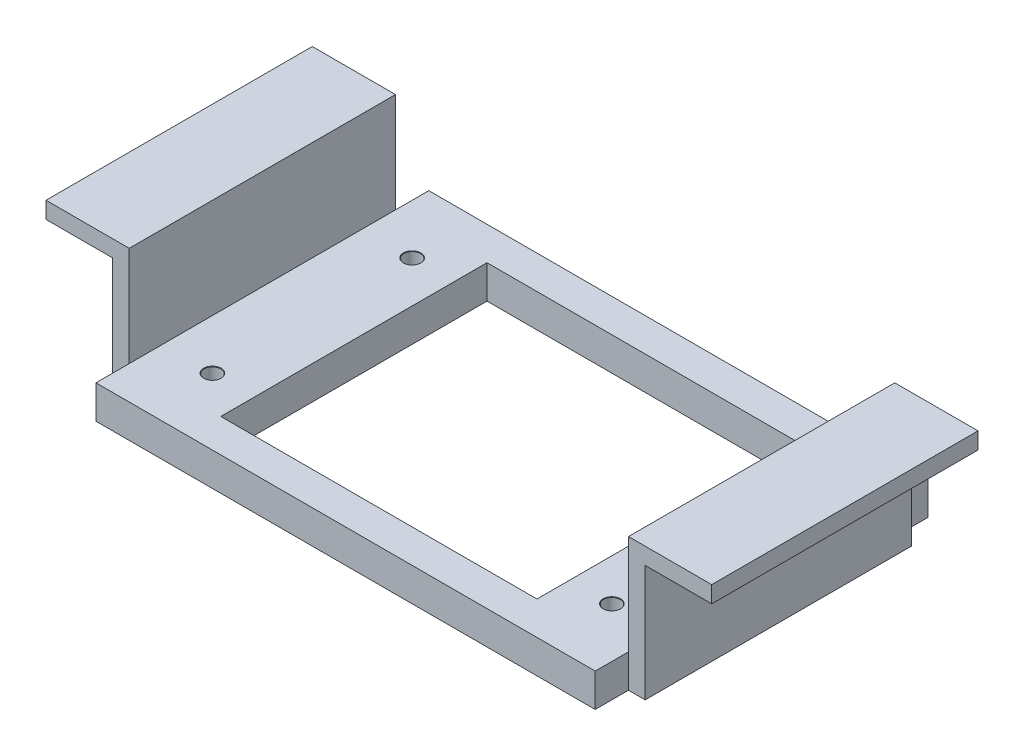
ISO-10303-21;
HEADER;
FILE_DESCRIPTION(('STEP AP214'),'2;1');
FILE_NAME('part.step','',(''),(''),'','','');
FILE_SCHEMA(('AUTOMOTIVE_DESIGN { 1 0 10303 214 1 1 1 1 }'));
ENDSEC;
DATA;
#1=APPLICATION_CONTEXT('core data for automotive mechanical design processes');
#2=APPLICATION_PROTOCOL_DEFINITION('international standard','automotive_design',2000,#1);
#3=PRODUCT_CONTEXT('',#1,'mechanical');
#4=PRODUCT('Part','Part','',(#3));
#5=PRODUCT_RELATED_PRODUCT_CATEGORY('part','',(#4));
#6=PRODUCT_DEFINITION_FORMATION('','',#4);
#7=PRODUCT_DEFINITION_CONTEXT('part definition',#1,'design');
#8=PRODUCT_DEFINITION('design','',#6,#7);
#9=PRODUCT_DEFINITION_SHAPE('','',#8);
#10=(LENGTH_UNIT() NAMED_UNIT(*) SI_UNIT(.MILLI.,.METRE.));
#11=(NAMED_UNIT(*) PLANE_ANGLE_UNIT() SI_UNIT($,.RADIAN.));
#12=(NAMED_UNIT(*) SI_UNIT($,.STERADIAN.) SOLID_ANGLE_UNIT());
#13=UNCERTAINTY_MEASURE_WITH_UNIT(LENGTH_MEASURE(1.E-05),#10,'distance_accuracy_value','');
#14=(GEOMETRIC_REPRESENTATION_CONTEXT(3) GLOBAL_UNCERTAINTY_ASSIGNED_CONTEXT((#13)) GLOBAL_UNIT_ASSIGNED_CONTEXT((#10,
#11,#12)) REPRESENTATION_CONTEXT('',''));
#15=CARTESIAN_POINT('',(0.,0.,0.));
#16=DIRECTION('',(0.,0.,1.));
#17=DIRECTION('',(1.,0.,0.));
#18=AXIS2_PLACEMENT_3D('',#15,#16,#17);
#19=CARTESIAN_POINT('',(16.,2.,8.));
#20=DIRECTION('',(0.,0.,-1.));
#21=DIRECTION('',(-1.,0.,0.));
#22=AXIS2_PLACEMENT_3D('',#19,#20,#21);
#23=PLANE('',#22);
#24=DIRECTION('',(0.,-1.,0.));
#25=VECTOR('',#24,1.);
#26=CARTESIAN_POINT('',(-15.,2.,8.));
#27=LINE('',#26,#25);
#28=CARTESIAN_POINT('',(-15.,2.,8.));
#29=VERTEX_POINT('',#28);
#30=CARTESIAN_POINT('',(-15.,0.,8.));
#31=VERTEX_POINT('',#30);
#32=EDGE_CURVE('E237',#29,#31,#27,.T.);
#33=ORIENTED_EDGE('',*,*,#32,.F.);
#34=DIRECTION('',(0.,-1.,0.));
#35=VECTOR('',#34,1.);
#36=CARTESIAN_POINT('',(-15.,8.,8.));
#37=LINE('',#36,#35);
#38=CARTESIAN_POINT('',(-15.,8.,8.));
#39=VERTEX_POINT('',#38);
#40=EDGE_CURVE('E456',#39,#29,#37,.T.);
#41=ORIENTED_EDGE('',*,*,#40,.F.);
#42=DIRECTION('',(1.,0.,0.));
#43=VECTOR('',#42,1.);
#44=CARTESIAN_POINT('',(-16.,8.,8.));
#45=LINE('',#44,#43);
#46=CARTESIAN_POINT('',(-20.,8.,8.));
#47=VERTEX_POINT('',#46);
#48=EDGE_CURVE('E440',#47,#39,#45,.T.);
#49=ORIENTED_EDGE('',*,*,#48,.F.);
#50=DIRECTION('',(0.,1.,0.));
#51=VECTOR('',#50,1.);
#52=CARTESIAN_POINT('',(-20.,8.,8.));
#53=LINE('',#52,#51);
#54=CARTESIAN_POINT('',(-20.,7.,8.));
#55=VERTEX_POINT('',#54);
#56=EDGE_CURVE('E399',#55,#47,#53,.T.);
#57=ORIENTED_EDGE('',*,*,#56,.F.);
#58=DIRECTION('',(1.,0.,0.));
#59=VECTOR('',#58,1.);
#60=CARTESIAN_POINT('',(-20.,7.,8.));
#61=LINE('',#60,#59);
#62=CARTESIAN_POINT('',(-16.,7.,8.));
#63=VERTEX_POINT('',#62);
#64=EDGE_CURVE('E407',#55,#63,#61,.T.);
#65=ORIENTED_EDGE('',*,*,#64,.T.);
#66=DIRECTION('',(0.,-1.,0.));
#67=VECTOR('',#66,1.);
#68=CARTESIAN_POINT('',(-16.,2.,8.));
#69=LINE('',#68,#67);
#70=CARTESIAN_POINT('',(-16.,0.,8.));
#71=VERTEX_POINT('',#70);
#72=EDGE_CURVE('E11',#63,#71,#69,.T.);
#73=ORIENTED_EDGE('',*,*,#72,.T.);
#74=DIRECTION('',(1.,0.,0.));
#75=VECTOR('',#74,1.);
#76=CARTESIAN_POINT('',(16.,0.,8.));
#77=LINE('',#76,#75);
#78=EDGE_CURVE('E473',#71,#31,#77,.T.);
#79=ORIENTED_EDGE('',*,*,#78,.T.);
#80=EDGE_LOOP('',(#33,#41,#49,#57,#65,#73,#79));
#81=FACE_BOUND('',#80,.T.);
#82=ADVANCED_FACE('F39',(#81),#23,.F.);
#83=DIRECTION('',(0.,1.,0.));
#84=VECTOR('',#83,1.);
#85=CARTESIAN_POINT('',(14.9984114699708,2.,8.));
#86=LINE('',#85,#84);
#87=CARTESIAN_POINT('',(14.9984114699708,0.,8.));
#88=VERTEX_POINT('',#87);
#89=CARTESIAN_POINT('',(14.9984114699708,2.,8.));
#90=VERTEX_POINT('',#89);
#91=EDGE_CURVE('E248',#88,#90,#86,.T.);
#92=ORIENTED_EDGE('',*,*,#91,.F.);
#93=CARTESIAN_POINT('',(16.,0.,8.));
#94=VERTEX_POINT('',#93);
#95=EDGE_CURVE('E472',#88,#94,#77,.T.);
#96=ORIENTED_EDGE('',*,*,#95,.T.);
#97=DIRECTION('',(0.,-1.,0.));
#98=VECTOR('',#97,1.);
#99=CARTESIAN_POINT('',(16.,2.,8.));
#100=LINE('',#99,#98);
#101=CARTESIAN_POINT('',(16.,7.,8.));
#102=VERTEX_POINT('',#101);
#103=EDGE_CURVE('E48',#102,#94,#100,.T.);
#104=ORIENTED_EDGE('',*,*,#103,.F.);
#105=DIRECTION('',(-1.,0.,0.));
#106=VECTOR('',#105,1.);
#107=CARTESIAN_POINT('',(20.,7.,8.));
#108=LINE('',#107,#106);
#109=CARTESIAN_POINT('',(20.,7.,8.));
#110=VERTEX_POINT('',#109);
#111=EDGE_CURVE('E387',#110,#102,#108,.T.);
#112=ORIENTED_EDGE('',*,*,#111,.F.);
#113=DIRECTION('',(0.,-1.,0.));
#114=VECTOR('',#113,1.);
#115=CARTESIAN_POINT('',(20.,8.,8.));
#116=LINE('',#115,#114);
#117=CARTESIAN_POINT('',(20.,8.,8.));
#118=VERTEX_POINT('',#117);
#119=EDGE_CURVE('E365',#118,#110,#116,.T.);
#120=ORIENTED_EDGE('',*,*,#119,.F.);
#121=DIRECTION('',(1.,0.,0.));
#122=VECTOR('',#121,1.);
#123=CARTESIAN_POINT('',(16.,8.,8.));
#124=LINE('',#123,#122);
#125=CARTESIAN_POINT('',(15.,8.,8.));
#126=VERTEX_POINT('',#125);
#127=EDGE_CURVE('E425',#126,#118,#124,.T.);
#128=ORIENTED_EDGE('',*,*,#127,.F.);
#129=DIRECTION('',(0.,-1.,0.));
#130=VECTOR('',#129,1.);
#131=CARTESIAN_POINT('',(15.,8.,8.));
#132=LINE('',#131,#130);
#133=CARTESIAN_POINT('',(15.,2.,8.));
#134=VERTEX_POINT('',#133);
#135=EDGE_CURVE('E428',#126,#134,#132,.T.);
#136=ORIENTED_EDGE('',*,*,#135,.T.);
#137=DIRECTION('',(1.,0.,0.));
#138=VECTOR('',#137,1.);
#139=CARTESIAN_POINT('',(16.,2.,8.));
#140=LINE('',#139,#138);
#141=EDGE_CURVE('E461',#90,#134,#140,.T.);
#142=ORIENTED_EDGE('',*,*,#141,.F.);
#143=EDGE_LOOP('',(#92,#96,#104,#112,#120,#128,#136,#142));
#144=FACE_BOUND('',#143,.T.);
#145=ADVANCED_FACE('F511',(#144),#23,.F.);
#146=CARTESIAN_POINT('',(16.,2.,-8.));
#147=DIRECTION('',(0.,0.,1.));
#148=DIRECTION('',(1.,0.,0.));
#149=AXIS2_PLACEMENT_3D('',#146,#147,#148);
#150=PLANE('',#149);
#151=DIRECTION('',(0.,-1.,0.));
#152=VECTOR('',#151,1.);
#153=CARTESIAN_POINT('',(15.,2.,-8.));
#154=LINE('',#153,#152);
#155=CARTESIAN_POINT('',(15.,2.,-8.));
#156=VERTEX_POINT('',#155);
#157=CARTESIAN_POINT('',(15.,0.,-8.));
#158=VERTEX_POINT('',#157);
#159=EDGE_CURVE('E279',#156,#158,#154,.T.);
#160=ORIENTED_EDGE('',*,*,#159,.F.);
#161=DIRECTION('',(0.,-1.,0.));
#162=VECTOR('',#161,1.);
#163=CARTESIAN_POINT('',(15.,8.,-8.));
#164=LINE('',#163,#162);
#165=CARTESIAN_POINT('',(15.,8.,-8.));
#166=VERTEX_POINT('',#165);
#167=EDGE_CURVE('E435',#166,#156,#164,.T.);
#168=ORIENTED_EDGE('',*,*,#167,.F.);
#169=DIRECTION('',(-1.,0.,0.));
#170=VECTOR('',#169,1.);
#171=CARTESIAN_POINT('',(16.,8.,-8.));
#172=LINE('',#171,#170);
#173=CARTESIAN_POINT('',(20.,8.,-8.));
#174=VERTEX_POINT('',#173);
#175=EDGE_CURVE('E419',#174,#166,#172,.T.);
#176=ORIENTED_EDGE('',*,*,#175,.F.);
#177=DIRECTION('',(0.,1.,0.));
#178=VECTOR('',#177,1.);
#179=CARTESIAN_POINT('',(20.,8.,-8.));
#180=LINE('',#179,#178);
#181=CARTESIAN_POINT('',(20.,7.,-8.));
#182=VERTEX_POINT('',#181);
#183=EDGE_CURVE('E372',#182,#174,#180,.T.);
#184=ORIENTED_EDGE('',*,*,#183,.F.);
#185=DIRECTION('',(-1.,0.,0.));
#186=VECTOR('',#185,1.);
#187=CARTESIAN_POINT('',(20.,7.,-8.));
#188=LINE('',#187,#186);
#189=CARTESIAN_POINT('',(16.,7.,-8.));
#190=VERTEX_POINT('',#189);
#191=EDGE_CURVE('E380',#182,#190,#188,.T.);
#192=ORIENTED_EDGE('',*,*,#191,.T.);
#193=DIRECTION('',(0.,-1.,0.));
#194=VECTOR('',#193,1.);
#195=CARTESIAN_POINT('',(16.,2.,-8.));
#196=LINE('',#195,#194);
#197=CARTESIAN_POINT('',(16.,0.,-8.));
#198=VERTEX_POINT('',#197);
#199=EDGE_CURVE('E486',#190,#198,#196,.T.);
#200=ORIENTED_EDGE('',*,*,#199,.T.);
#201=DIRECTION('',(-1.,0.,0.));
#202=VECTOR('',#201,1.);
#203=CARTESIAN_POINT('',(16.,0.,-8.));
#204=LINE('',#203,#202);
#205=EDGE_CURVE('E465',#198,#158,#204,.T.);
#206=ORIENTED_EDGE('',*,*,#205,.T.);
#207=EDGE_LOOP('',(#160,#168,#176,#184,#192,#200,#206));
#208=FACE_BOUND('',#207,.T.);
#209=ADVANCED_FACE('F503',(#208),#150,.F.);
#210=DIRECTION('',(0.,1.,0.));
#211=VECTOR('',#210,1.);
#212=CARTESIAN_POINT('',(-14.9984114699708,2.,-8.));
#213=LINE('',#212,#211);
#214=CARTESIAN_POINT('',(-14.9984114699708,0.,-8.));
#215=VERTEX_POINT('',#214);
#216=CARTESIAN_POINT('',(-14.9984114699708,2.,-8.));
#217=VERTEX_POINT('',#216);
#218=EDGE_CURVE('E285',#215,#217,#213,.T.);
#219=ORIENTED_EDGE('',*,*,#218,.F.);
#220=CARTESIAN_POINT('',(-16.,0.,-8.));
#221=VERTEX_POINT('',#220);
#222=EDGE_CURVE('E480',#215,#221,#204,.T.);
#223=ORIENTED_EDGE('',*,*,#222,.T.);
#224=DIRECTION('',(0.,-1.,0.));
#225=VECTOR('',#224,1.);
#226=CARTESIAN_POINT('',(-16.,2.,-8.));
#227=LINE('',#226,#225);
#228=CARTESIAN_POINT('',(-16.,7.,-8.));
#229=VERTEX_POINT('',#228);
#230=EDGE_CURVE('E468',#229,#221,#227,.T.);
#231=ORIENTED_EDGE('',*,*,#230,.F.);
#232=DIRECTION('',(1.,0.,0.));
#233=VECTOR('',#232,1.);
#234=CARTESIAN_POINT('',(-20.,7.,-8.));
#235=LINE('',#234,#233);
#236=CARTESIAN_POINT('',(-20.,7.,-8.));
#237=VERTEX_POINT('',#236);
#238=EDGE_CURVE('E414',#237,#229,#235,.T.);
#239=ORIENTED_EDGE('',*,*,#238,.F.);
#240=DIRECTION('',(0.,-1.,0.));
#241=VECTOR('',#240,1.);
#242=CARTESIAN_POINT('',(-20.,8.,-8.));
#243=LINE('',#242,#241);
#244=CARTESIAN_POINT('',(-20.,8.,-8.));
#245=VERTEX_POINT('',#244);
#246=EDGE_CURVE('E392',#245,#237,#243,.T.);
#247=ORIENTED_EDGE('',*,*,#246,.F.);
#248=DIRECTION('',(-1.,0.,0.));
#249=VECTOR('',#248,1.);
#250=CARTESIAN_POINT('',(-16.,8.,-8.));
#251=LINE('',#250,#249);
#252=CARTESIAN_POINT('',(-15.,8.,-8.));
#253=VERTEX_POINT('',#252);
#254=EDGE_CURVE('E446',#253,#245,#251,.T.);
#255=ORIENTED_EDGE('',*,*,#254,.F.);
#256=DIRECTION('',(0.,-1.,0.));
#257=VECTOR('',#256,1.);
#258=CARTESIAN_POINT('',(-15.,8.,-8.));
#259=LINE('',#258,#257);
#260=CARTESIAN_POINT('',(-15.,2.,-8.));
#261=VERTEX_POINT('',#260);
#262=EDGE_CURVE('E449',#253,#261,#259,.T.);
#263=ORIENTED_EDGE('',*,*,#262,.T.);
#264=DIRECTION('',(-1.,0.,0.));
#265=VECTOR('',#264,1.);
#266=CARTESIAN_POINT('',(16.,2.,-8.));
#267=LINE('',#266,#265);
#268=EDGE_CURVE('E464',#217,#261,#267,.T.);
#269=ORIENTED_EDGE('',*,*,#268,.F.);
#270=EDGE_LOOP('',(#219,#223,#231,#239,#247,#255,#263,#269));
#271=FACE_BOUND('',#270,.T.);
#272=ADVANCED_FACE('F591',(#271),#150,.F.);
#273=CARTESIAN_POINT('',(16.,2.,8.));
#274=DIRECTION('',(-1.,0.,0.));
#275=DIRECTION('',(0.,0.,1.));
#276=AXIS2_PLACEMENT_3D('',#273,#274,#275);
#277=PLANE('',#276);
#278=DIRECTION('',(0.,0.,-1.));
#279=VECTOR('',#278,1.);
#280=CARTESIAN_POINT('',(16.,7.,8.));
#281=LINE('',#280,#279);
#282=EDGE_CURVE('E364',#102,#190,#281,.T.);
#283=ORIENTED_EDGE('',*,*,#282,.F.);
#284=ORIENTED_EDGE('',*,*,#103,.T.);
#285=DIRECTION('',(0.,0.,-1.));
#286=VECTOR('',#285,1.);
#287=CARTESIAN_POINT('',(16.,0.,8.));
#288=LINE('',#287,#286);
#289=EDGE_CURVE('E476',#94,#198,#288,.T.);
#290=ORIENTED_EDGE('',*,*,#289,.T.);
#291=ORIENTED_EDGE('',*,*,#199,.F.);
#292=EDGE_LOOP('',(#283,#284,#290,#291));
#293=FACE_BOUND('',#292,.T.);
#294=ADVANCED_FACE('F493',(#293),#277,.F.);
#295=CARTESIAN_POINT('',(-16.,2.,8.));
#296=DIRECTION('',(1.,0.,0.));
#297=DIRECTION('',(0.,0.,-1.));
#298=AXIS2_PLACEMENT_3D('',#295,#296,#297);
#299=PLANE('',#298);
#300=DIRECTION('',(0.,0.,1.));
#301=VECTOR('',#300,1.);
#302=CARTESIAN_POINT('',(-16.,7.,-8.));
#303=LINE('',#302,#301);
#304=EDGE_CURVE('E391',#229,#63,#303,.T.);
#305=ORIENTED_EDGE('',*,*,#304,.F.);
#306=ORIENTED_EDGE('',*,*,#230,.T.);
#307=DIRECTION('',(0.,0.,1.));
#308=VECTOR('',#307,1.);
#309=CARTESIAN_POINT('',(-16.,0.,8.));
#310=LINE('',#309,#308);
#311=EDGE_CURVE('E460',#221,#71,#310,.T.);
#312=ORIENTED_EDGE('',*,*,#311,.T.);
#313=ORIENTED_EDGE('',*,*,#72,.F.);
#314=EDGE_LOOP('',(#305,#306,#312,#313));
#315=FACE_BOUND('',#314,.T.);
#316=ADVANCED_FACE('F41',(#315),#299,.F.);
#317=CARTESIAN_POINT('',(0.,2.,0.));
#318=DIRECTION('',(0.,1.,0.));
#319=DIRECTION('',(0.,0.,1.));
#320=AXIS2_PLACEMENT_3D('',#317,#318,#319);
#321=PLANE('',#320);
#322=DIRECTION('',(0.,0.,1.));
#323=VECTOR('',#322,1.);
#324=CARTESIAN_POINT('',(-9.5,2.,8.));
#325=LINE('',#324,#323);
#326=CARTESIAN_POINT('',(-9.5,2.,-8.));
#327=VERTEX_POINT('',#326);
#328=CARTESIAN_POINT('',(-9.5,2.,8.));
#329=VERTEX_POINT('',#328);
#330=EDGE_CURVE('E55',#327,#329,#325,.T.);
#331=ORIENTED_EDGE('',*,*,#330,.F.);
#332=DIRECTION('',(-1.,0.,0.));
#333=VECTOR('',#332,1.);
#334=CARTESIAN_POINT('',(9.5,2.,-8.));
#335=LINE('',#334,#333);
#336=CARTESIAN_POINT('',(9.5,2.,-8.));
#337=VERTEX_POINT('',#336);
#338=EDGE_CURVE('E215',#337,#327,#335,.T.);
#339=ORIENTED_EDGE('',*,*,#338,.F.);
#340=DIRECTION('',(0.,0.,-1.));
#341=VECTOR('',#340,1.);
#342=CARTESIAN_POINT('',(9.5,2.,8.));
#343=LINE('',#342,#341);
#344=CARTESIAN_POINT('',(9.5,2.,8.));
#345=VERTEX_POINT('',#344);
#346=EDGE_CURVE('E219',#345,#337,#343,.T.);
#347=ORIENTED_EDGE('',*,*,#346,.F.);
#348=DIRECTION('',(1.,0.,0.));
#349=VECTOR('',#348,1.);
#350=CARTESIAN_POINT('',(9.5,2.,8.));
#351=LINE('',#350,#349);
#352=EDGE_CURVE('E228',#329,#345,#351,.T.);
#353=ORIENTED_EDGE('',*,*,#352,.F.);
#354=EDGE_LOOP('',(#331,#339,#347,#353));
#355=FACE_BOUND('',#354,.T.);
#356=CARTESIAN_POINT('',(-12.,2.,-6.));
#357=DIRECTION('',(0.,1.,0.));
#358=DIRECTION('',(0.,0.,1.));
#359=AXIS2_PLACEMENT_3D('',#356,#357,#358);
#360=CIRCLE('',#359,0.524999999999999);
#361=CARTESIAN_POINT('',(-12.,2.,-5.475));
#362=VERTEX_POINT('',#361);
#363=EDGE_CURVE('E316',#362,#362,#360,.T.);
#364=ORIENTED_EDGE('',*,*,#363,.F.);
#365=EDGE_LOOP('',(#364));
#366=FACE_BOUND('',#365,.T.);
#367=CARTESIAN_POINT('',(-12.,2.,6.));
#368=DIRECTION('',(0.,1.,0.));
#369=DIRECTION('',(0.,0.,1.));
#370=AXIS2_PLACEMENT_3D('',#367,#368,#369);
#371=CIRCLE('',#370,0.524999999999999);
#372=CARTESIAN_POINT('',(-12.,2.,6.525));
#373=VERTEX_POINT('',#372);
#374=EDGE_CURVE('E328',#373,#373,#371,.T.);
#375=ORIENTED_EDGE('',*,*,#374,.F.);
#376=EDGE_LOOP('',(#375));
#377=FACE_BOUND('',#376,.T.);
#378=CARTESIAN_POINT('',(12.,2.,6.));
#379=DIRECTION('',(0.,1.,0.));
#380=DIRECTION('',(0.,0.,1.));
#381=AXIS2_PLACEMENT_3D('',#378,#379,#380);
#382=CIRCLE('',#381,0.524999999999999);
#383=CARTESIAN_POINT('',(12.,2.,6.525));
#384=VERTEX_POINT('',#383);
#385=EDGE_CURVE('E340',#384,#384,#382,.T.);
#386=ORIENTED_EDGE('',*,*,#385,.F.);
#387=EDGE_LOOP('',(#386));
#388=FACE_BOUND('',#387,.T.);
#389=CARTESIAN_POINT('',(12.,2.,-6.));
#390=DIRECTION('',(0.,1.,0.));
#391=DIRECTION('',(0.,0.,1.));
#392=AXIS2_PLACEMENT_3D('',#389,#390,#391);
#393=CIRCLE('',#392,0.524999999999999);
#394=CARTESIAN_POINT('',(12.,2.,-5.475));
#395=VERTEX_POINT('',#394);
#396=EDGE_CURVE('E352',#395,#395,#393,.T.);
#397=ORIENTED_EDGE('',*,*,#396,.F.);
#398=EDGE_LOOP('',(#397));
#399=FACE_BOUND('',#398,.T.);
#400=DIRECTION('',(0.,0.,-1.));
#401=VECTOR('',#400,1.);
#402=CARTESIAN_POINT('',(-15.,2.,-8.));
#403=LINE('',#402,#401);
#404=EDGE_CURVE('E439',#29,#261,#403,.T.);
#405=ORIENTED_EDGE('',*,*,#404,.F.);
#406=DIRECTION('',(0.,0.,-1.));
#407=VECTOR('',#406,1.);
#408=CARTESIAN_POINT('',(-15.,2.,10.));
#409=LINE('',#408,#407);
#410=CARTESIAN_POINT('',(-15.,2.,10.));
#411=VERTEX_POINT('',#410);
#412=EDGE_CURVE('E257',#411,#29,#409,.T.);
#413=ORIENTED_EDGE('',*,*,#412,.F.);
#414=DIRECTION('',(-1.,0.,0.));
#415=VECTOR('',#414,1.);
#416=CARTESIAN_POINT('',(-15.,2.,10.));
#417=LINE('',#416,#415);
#418=CARTESIAN_POINT('',(14.9984114699708,2.,10.));
#419=VERTEX_POINT('',#418);
#420=EDGE_CURVE('E254',#419,#411,#417,.T.);
#421=ORIENTED_EDGE('',*,*,#420,.F.);
#422=DIRECTION('',(0.,0.,-1.));
#423=VECTOR('',#422,1.);
#424=CARTESIAN_POINT('',(14.9984114699708,2.,10.));
#425=LINE('',#424,#423);
#426=EDGE_CURVE('E267',#419,#90,#425,.T.);
#427=ORIENTED_EDGE('',*,*,#426,.T.);
#428=ORIENTED_EDGE('',*,*,#141,.T.);
#429=DIRECTION('',(0.,0.,1.));
#430=VECTOR('',#429,1.);
#431=CARTESIAN_POINT('',(15.,2.,-8.));
#432=LINE('',#431,#430);
#433=EDGE_CURVE('E418',#156,#134,#432,.T.);
#434=ORIENTED_EDGE('',*,*,#433,.F.);
#435=DIRECTION('',(0.,0.,1.));
#436=VECTOR('',#435,1.);
#437=CARTESIAN_POINT('',(15.,2.,-10.));
#438=LINE('',#437,#436);
#439=CARTESIAN_POINT('',(15.,2.,-10.));
#440=VERTEX_POINT('',#439);
#441=EDGE_CURVE('E294',#440,#156,#438,.T.);
#442=ORIENTED_EDGE('',*,*,#441,.F.);
#443=DIRECTION('',(1.,0.,0.));
#444=VECTOR('',#443,1.);
#445=CARTESIAN_POINT('',(15.,2.,-10.));
#446=LINE('',#445,#444);
#447=CARTESIAN_POINT('',(-14.9984114699708,2.,-10.));
#448=VERTEX_POINT('',#447);
#449=EDGE_CURVE('E291',#448,#440,#446,.T.);
#450=ORIENTED_EDGE('',*,*,#449,.F.);
#451=DIRECTION('',(0.,0.,1.));
#452=VECTOR('',#451,1.);
#453=CARTESIAN_POINT('',(-14.9984114699708,2.,-10.));
#454=LINE('',#453,#452);
#455=EDGE_CURVE('E304',#448,#217,#454,.T.);
#456=ORIENTED_EDGE('',*,*,#455,.T.);
#457=ORIENTED_EDGE('',*,*,#268,.T.);
#458=EDGE_LOOP('',(#405,#413,#421,#427,#428,#434,#442,#450,#456,#457));
#459=FACE_BOUND('',#458,.T.);
#460=ADVANCED_FACE('F529',(#355,#366,#377,#388,#399,#459),#321,.T.);
#461=CARTESIAN_POINT('',(0.,0.,0.));
#462=DIRECTION('',(0.,1.,0.));
#463=DIRECTION('',(0.,0.,1.));
#464=AXIS2_PLACEMENT_3D('',#461,#462,#463);
#465=PLANE('',#464);
#466=DIRECTION('',(-1.,0.,0.));
#467=VECTOR('',#466,1.);
#468=CARTESIAN_POINT('',(9.5,0.,-8.));
#469=LINE('',#468,#467);
#470=CARTESIAN_POINT('',(9.5,0.,-8.));
#471=VERTEX_POINT('',#470);
#472=CARTESIAN_POINT('',(-9.5,0.,-8.));
#473=VERTEX_POINT('',#472);
#474=EDGE_CURVE('E203',#471,#473,#469,.T.);
#475=ORIENTED_EDGE('',*,*,#474,.T.);
#476=DIRECTION('',(0.,0.,1.));
#477=VECTOR('',#476,1.);
#478=CARTESIAN_POINT('',(-9.5,0.,8.));
#479=LINE('',#478,#477);
#480=CARTESIAN_POINT('',(-9.5,0.,8.));
#481=VERTEX_POINT('',#480);
#482=EDGE_CURVE('E196',#473,#481,#479,.T.);
#483=ORIENTED_EDGE('',*,*,#482,.T.);
#484=DIRECTION('',(1.,0.,0.));
#485=VECTOR('',#484,1.);
#486=CARTESIAN_POINT('',(9.5,0.,8.));
#487=LINE('',#486,#485);
#488=CARTESIAN_POINT('',(9.5,0.,8.));
#489=VERTEX_POINT('',#488);
#490=EDGE_CURVE('E206',#481,#489,#487,.T.);
#491=ORIENTED_EDGE('',*,*,#490,.T.);
#492=DIRECTION('',(0.,0.,-1.));
#493=VECTOR('',#492,1.);
#494=CARTESIAN_POINT('',(9.5,0.,8.));
#495=LINE('',#494,#493);
#496=EDGE_CURVE('E63',#489,#471,#495,.T.);
#497=ORIENTED_EDGE('',*,*,#496,.T.);
#498=EDGE_LOOP('',(#475,#483,#491,#497));
#499=FACE_BOUND('',#498,.T.);
#500=CARTESIAN_POINT('',(-12.,0.,-6.));
#501=DIRECTION('',(0.,1.,0.));
#502=DIRECTION('',(0.,0.,1.));
#503=AXIS2_PLACEMENT_3D('',#500,#501,#502);
#504=CIRCLE('',#503,0.5);
#505=CARTESIAN_POINT('',(-12.,0.,-5.5));
#506=VERTEX_POINT('',#505);
#507=EDGE_CURVE('E324',#506,#506,#504,.T.);
#508=ORIENTED_EDGE('',*,*,#507,.T.);
#509=EDGE_LOOP('',(#508));
#510=FACE_BOUND('',#509,.T.);
#511=CARTESIAN_POINT('',(-12.,0.,6.));
#512=DIRECTION('',(0.,1.,0.));
#513=DIRECTION('',(0.,0.,1.));
#514=AXIS2_PLACEMENT_3D('',#511,#512,#513);
#515=CIRCLE('',#514,0.5);
#516=CARTESIAN_POINT('',(-12.,0.,6.5));
#517=VERTEX_POINT('',#516);
#518=EDGE_CURVE('E336',#517,#517,#515,.T.);
#519=ORIENTED_EDGE('',*,*,#518,.T.);
#520=EDGE_LOOP('',(#519));
#521=FACE_BOUND('',#520,.T.);
#522=CARTESIAN_POINT('',(12.,0.,6.));
#523=DIRECTION('',(0.,1.,0.));
#524=DIRECTION('',(0.,0.,1.));
#525=AXIS2_PLACEMENT_3D('',#522,#523,#524);
#526=CIRCLE('',#525,0.5);
#527=CARTESIAN_POINT('',(12.,0.,6.5));
#528=VERTEX_POINT('',#527);
#529=EDGE_CURVE('E348',#528,#528,#526,.T.);
#530=ORIENTED_EDGE('',*,*,#529,.T.);
#531=EDGE_LOOP('',(#530));
#532=FACE_BOUND('',#531,.T.);
#533=CARTESIAN_POINT('',(12.,0.,-6.));
#534=DIRECTION('',(0.,1.,0.));
#535=DIRECTION('',(0.,0.,1.));
#536=AXIS2_PLACEMENT_3D('',#533,#534,#535);
#537=CIRCLE('',#536,0.5);
#538=CARTESIAN_POINT('',(12.,0.,-5.5));
#539=VERTEX_POINT('',#538);
#540=EDGE_CURVE('E360',#539,#539,#537,.T.);
#541=ORIENTED_EDGE('',*,*,#540,.T.);
#542=EDGE_LOOP('',(#541));
#543=FACE_BOUND('',#542,.T.);
#544=ORIENTED_EDGE('',*,*,#311,.F.);
#545=ORIENTED_EDGE('',*,*,#222,.F.);
#546=DIRECTION('',(0.,0.,1.));
#547=VECTOR('',#546,1.);
#548=CARTESIAN_POINT('',(-14.9984114699708,0.,-10.));
#549=LINE('',#548,#547);
#550=CARTESIAN_POINT('',(-14.9984114699708,0.,-10.));
#551=VERTEX_POINT('',#550);
#552=EDGE_CURVE('E308',#551,#215,#549,.T.);
#553=ORIENTED_EDGE('',*,*,#552,.F.);
#554=DIRECTION('',(-1.,0.,0.));
#555=VECTOR('',#554,1.);
#556=CARTESIAN_POINT('',(15.,0.,-10.));
#557=LINE('',#556,#555);
#558=CARTESIAN_POINT('',(15.,0.,-10.));
#559=VERTEX_POINT('',#558);
#560=EDGE_CURVE('E284',#559,#551,#557,.T.);
#561=ORIENTED_EDGE('',*,*,#560,.F.);
#562=DIRECTION('',(0.,0.,1.));
#563=VECTOR('',#562,1.);
#564=CARTESIAN_POINT('',(15.,0.,-10.));
#565=LINE('',#564,#563);
#566=EDGE_CURVE('E312',#559,#158,#565,.T.);
#567=ORIENTED_EDGE('',*,*,#566,.T.);
#568=ORIENTED_EDGE('',*,*,#205,.F.);
#569=ORIENTED_EDGE('',*,*,#289,.F.);
#570=ORIENTED_EDGE('',*,*,#95,.F.);
#571=DIRECTION('',(0.,0.,-1.));
#572=VECTOR('',#571,1.);
#573=CARTESIAN_POINT('',(14.9984114699708,0.,10.));
#574=LINE('',#573,#572);
#575=CARTESIAN_POINT('',(14.9984114699708,0.,10.));
#576=VERTEX_POINT('',#575);
#577=EDGE_CURVE('E271',#576,#88,#574,.T.);
#578=ORIENTED_EDGE('',*,*,#577,.F.);
#579=DIRECTION('',(1.,0.,0.));
#580=VECTOR('',#579,1.);
#581=CARTESIAN_POINT('',(-15.,0.,10.));
#582=LINE('',#581,#580);
#583=CARTESIAN_POINT('',(-15.,0.,10.));
#584=VERTEX_POINT('',#583);
#585=EDGE_CURVE('E247',#584,#576,#582,.T.);
#586=ORIENTED_EDGE('',*,*,#585,.F.);
#587=DIRECTION('',(0.,0.,-1.));
#588=VECTOR('',#587,1.);
#589=CARTESIAN_POINT('',(-15.,0.,10.));
#590=LINE('',#589,#588);
#591=EDGE_CURVE('E275',#584,#31,#590,.T.);
#592=ORIENTED_EDGE('',*,*,#591,.T.);
#593=ORIENTED_EDGE('',*,*,#78,.F.);
#594=EDGE_LOOP('',(#544,#545,#553,#561,#567,#568,#569,#570,#578,#586,#592,#593));
#595=FACE_BOUND('',#594,.T.);
#596=ADVANCED_FACE('F211',(#499,#510,#521,#532,#543,#595),#465,.F.);
#597=CARTESIAN_POINT('',(-15.,8.,-8.));
#598=DIRECTION('',(-1.,0.,0.));
#599=DIRECTION('',(0.,0.,1.));
#600=AXIS2_PLACEMENT_3D('',#597,#598,#599);
#601=PLANE('',#600);
#602=ORIENTED_EDGE('',*,*,#404,.T.);
#603=ORIENTED_EDGE('',*,*,#262,.F.);
#604=DIRECTION('',(0.,0.,-1.));
#605=VECTOR('',#604,1.);
#606=CARTESIAN_POINT('',(-15.,8.,-8.));
#607=LINE('',#606,#605);
#608=EDGE_CURVE('E443',#39,#253,#607,.T.);
#609=ORIENTED_EDGE('',*,*,#608,.F.);
#610=ORIENTED_EDGE('',*,*,#40,.T.);
#611=EDGE_LOOP('',(#602,#603,#609,#610));
#612=FACE_BOUND('',#611,.T.);
#613=ADVANCED_FACE('F543',(#612),#601,.F.);
#614=CARTESIAN_POINT('',(0.,8.,0.));
#615=DIRECTION('',(0.,1.,0.));
#616=DIRECTION('',(0.,0.,1.));
#617=AXIS2_PLACEMENT_3D('',#614,#615,#616);
#618=PLANE('',#617);
#619=ORIENTED_EDGE('',*,*,#254,.T.);
#620=DIRECTION('',(0.,0.,-1.));
#621=VECTOR('',#620,1.);
#622=CARTESIAN_POINT('',(-20.,8.,-8.));
#623=LINE('',#622,#621);
#624=EDGE_CURVE('E403',#47,#245,#623,.T.);
#625=ORIENTED_EDGE('',*,*,#624,.F.);
#626=ORIENTED_EDGE('',*,*,#48,.T.);
#627=ORIENTED_EDGE('',*,*,#608,.T.);
#628=EDGE_LOOP('',(#619,#625,#626,#627));
#629=FACE_BOUND('',#628,.T.);
#630=ADVANCED_FACE('F546',(#629),#618,.T.);
#631=CARTESIAN_POINT('',(15.,8.,-8.));
#632=DIRECTION('',(1.,0.,0.));
#633=DIRECTION('',(0.,0.,-1.));
#634=AXIS2_PLACEMENT_3D('',#631,#632,#633);
#635=PLANE('',#634);
#636=ORIENTED_EDGE('',*,*,#433,.T.);
#637=ORIENTED_EDGE('',*,*,#135,.F.);
#638=DIRECTION('',(0.,0.,1.));
#639=VECTOR('',#638,1.);
#640=CARTESIAN_POINT('',(15.,8.,-8.));
#641=LINE('',#640,#639);
#642=EDGE_CURVE('E422',#166,#126,#641,.T.);
#643=ORIENTED_EDGE('',*,*,#642,.F.);
#644=ORIENTED_EDGE('',*,*,#167,.T.);
#645=EDGE_LOOP('',(#636,#637,#643,#644));
#646=FACE_BOUND('',#645,.T.);
#647=ADVANCED_FACE('F521',(#646),#635,.F.);
#648=CARTESIAN_POINT('',(0.,8.,0.));
#649=DIRECTION('',(0.,-1.,0.));
#650=DIRECTION('',(0.,0.,-1.));
#651=AXIS2_PLACEMENT_3D('',#648,#649,#650);
#652=PLANE('',#651);
#653=ORIENTED_EDGE('',*,*,#127,.T.);
#654=DIRECTION('',(0.,0.,1.));
#655=VECTOR('',#654,1.);
#656=CARTESIAN_POINT('',(20.,8.,8.));
#657=LINE('',#656,#655);
#658=EDGE_CURVE('E376',#174,#118,#657,.T.);
#659=ORIENTED_EDGE('',*,*,#658,.F.);
#660=ORIENTED_EDGE('',*,*,#175,.T.);
#661=ORIENTED_EDGE('',*,*,#642,.T.);
#662=EDGE_LOOP('',(#653,#659,#660,#661));
#663=FACE_BOUND('',#662,.T.);
#664=ADVANCED_FACE('F517',(#663),#652,.F.);
#665=CARTESIAN_POINT('',(-20.,7.,-8.));
#666=DIRECTION('',(0.,1.,0.));
#667=DIRECTION('',(0.,0.,1.));
#668=AXIS2_PLACEMENT_3D('',#665,#666,#667);
#669=PLANE('',#668);
#670=ORIENTED_EDGE('',*,*,#304,.T.);
#671=ORIENTED_EDGE('',*,*,#64,.F.);
#672=DIRECTION('',(0.,0.,1.));
#673=VECTOR('',#672,1.);
#674=CARTESIAN_POINT('',(-20.,7.,-8.));
#675=LINE('',#674,#673);
#676=EDGE_CURVE('E396',#237,#55,#675,.T.);
#677=ORIENTED_EDGE('',*,*,#676,.F.);
#678=ORIENTED_EDGE('',*,*,#238,.T.);
#679=EDGE_LOOP('',(#670,#671,#677,#678));
#680=FACE_BOUND('',#679,.T.);
#681=ADVANCED_FACE('F555',(#680),#669,.F.);
#682=CARTESIAN_POINT('',(-20.,0.,0.));
#683=DIRECTION('',(-1.,0.,0.));
#684=DIRECTION('',(0.,0.,1.));
#685=AXIS2_PLACEMENT_3D('',#682,#683,#684);
#686=PLANE('',#685);
#687=ORIENTED_EDGE('',*,*,#246,.T.);
#688=ORIENTED_EDGE('',*,*,#676,.T.);
#689=ORIENTED_EDGE('',*,*,#56,.T.);
#690=ORIENTED_EDGE('',*,*,#624,.T.);
#691=EDGE_LOOP('',(#687,#688,#689,#690));
#692=FACE_BOUND('',#691,.T.);
#693=ADVANCED_FACE('F550',(#692),#686,.T.);
#694=CARTESIAN_POINT('',(20.,7.,8.));
#695=DIRECTION('',(0.,1.,0.));
#696=DIRECTION('',(0.,0.,1.));
#697=AXIS2_PLACEMENT_3D('',#694,#695,#696);
#698=PLANE('',#697);
#699=ORIENTED_EDGE('',*,*,#282,.T.);
#700=ORIENTED_EDGE('',*,*,#191,.F.);
#701=DIRECTION('',(0.,0.,-1.));
#702=VECTOR('',#701,1.);
#703=CARTESIAN_POINT('',(20.,7.,8.));
#704=LINE('',#703,#702);
#705=EDGE_CURVE('E369',#110,#182,#704,.T.);
#706=ORIENTED_EDGE('',*,*,#705,.F.);
#707=ORIENTED_EDGE('',*,*,#111,.T.);
#708=EDGE_LOOP('',(#699,#700,#706,#707));
#709=FACE_BOUND('',#708,.T.);
#710=ADVANCED_FACE('F509',(#709),#698,.F.);
#711=CARTESIAN_POINT('',(20.,0.,0.));
#712=DIRECTION('',(1.,0.,0.));
#713=DIRECTION('',(0.,0.,-1.));
#714=AXIS2_PLACEMENT_3D('',#711,#712,#713);
#715=PLANE('',#714);
#716=ORIENTED_EDGE('',*,*,#119,.T.);
#717=ORIENTED_EDGE('',*,*,#705,.T.);
#718=ORIENTED_EDGE('',*,*,#183,.T.);
#719=ORIENTED_EDGE('',*,*,#658,.T.);
#720=EDGE_LOOP('',(#716,#717,#718,#719));
#721=FACE_BOUND('',#720,.T.);
#722=ADVANCED_FACE('F514',(#721),#715,.T.);
#723=CARTESIAN_POINT('',(12.,2.,-6.));
#724=DIRECTION('',(0.,1.,0.));
#725=DIRECTION('',(0.,0.,1.));
#726=AXIS2_PLACEMENT_3D('',#723,#724,#725);
#727=CYLINDRICAL_SURFACE('',#726,0.5);
#728=ORIENTED_EDGE('',*,*,#540,.F.);
#729=EDGE_LOOP('',(#728));
#730=FACE_BOUND('',#729,.T.);
#731=CARTESIAN_POINT('',(12.,1.975,-6.));
#732=DIRECTION('',(0.,1.,0.));
#733=DIRECTION('',(0.,0.,1.));
#734=AXIS2_PLACEMENT_3D('',#731,#732,#733);
#735=CIRCLE('',#734,0.5);
#736=CARTESIAN_POINT('',(12.,1.975,-5.5));
#737=VERTEX_POINT('',#736);
#738=EDGE_CURVE('E356',#737,#737,#735,.T.);
#739=ORIENTED_EDGE('',*,*,#738,.T.);
#740=EDGE_LOOP('',(#739));
#741=FACE_BOUND('',#740,.T.);
#742=ADVANCED_FACE('F615',(#730,#741),#727,.F.);
#743=CARTESIAN_POINT('',(12.,2.,-6.));
#744=DIRECTION('',(0.,1.,0.));
#745=DIRECTION('',(0.,0.,1.));
#746=AXIS2_PLACEMENT_3D('',#743,#744,#745);
#747=CONICAL_SURFACE('',#746,0.524999999999999,0.785398163397422);
#748=ORIENTED_EDGE('',*,*,#738,.F.);
#749=EDGE_LOOP('',(#748));
#750=FACE_BOUND('',#749,.T.);
#751=ORIENTED_EDGE('',*,*,#396,.T.);
#752=EDGE_LOOP('',(#751));
#753=FACE_BOUND('',#752,.T.);
#754=ADVANCED_FACE('F618',(#750,#753),#747,.F.);
#755=CARTESIAN_POINT('',(12.,2.,6.));
#756=DIRECTION('',(0.,1.,0.));
#757=DIRECTION('',(0.,0.,1.));
#758=AXIS2_PLACEMENT_3D('',#755,#756,#757);
#759=CYLINDRICAL_SURFACE('',#758,0.5);
#760=ORIENTED_EDGE('',*,*,#529,.F.);
#761=EDGE_LOOP('',(#760));
#762=FACE_BOUND('',#761,.T.);
#763=CARTESIAN_POINT('',(12.,1.975,6.));
#764=DIRECTION('',(0.,1.,0.));
#765=DIRECTION('',(0.,0.,1.));
#766=AXIS2_PLACEMENT_3D('',#763,#764,#765);
#767=CIRCLE('',#766,0.5);
#768=CARTESIAN_POINT('',(12.,1.975,6.5));
#769=VERTEX_POINT('',#768);
#770=EDGE_CURVE('E344',#769,#769,#767,.T.);
#771=ORIENTED_EDGE('',*,*,#770,.T.);
#772=EDGE_LOOP('',(#771));
#773=FACE_BOUND('',#772,.T.);
#774=ADVANCED_FACE('F622',(#762,#773),#759,.F.);
#775=CARTESIAN_POINT('',(12.,2.,6.));
#776=DIRECTION('',(0.,1.,0.));
#777=DIRECTION('',(0.,0.,1.));
#778=AXIS2_PLACEMENT_3D('',#775,#776,#777);
#779=CONICAL_SURFACE('',#778,0.524999999999999,0.785398163397422);
#780=ORIENTED_EDGE('',*,*,#770,.F.);
#781=EDGE_LOOP('',(#780));
#782=FACE_BOUND('',#781,.T.);
#783=ORIENTED_EDGE('',*,*,#385,.T.);
#784=EDGE_LOOP('',(#783));
#785=FACE_BOUND('',#784,.T.);
#786=ADVANCED_FACE('F626',(#782,#785),#779,.F.);
#787=CARTESIAN_POINT('',(-12.,2.,6.));
#788=DIRECTION('',(0.,1.,0.));
#789=DIRECTION('',(0.,0.,1.));
#790=AXIS2_PLACEMENT_3D('',#787,#788,#789);
#791=CYLINDRICAL_SURFACE('',#790,0.5);
#792=ORIENTED_EDGE('',*,*,#518,.F.);
#793=EDGE_LOOP('',(#792));
#794=FACE_BOUND('',#793,.T.);
#795=CARTESIAN_POINT('',(-12.,1.975,6.));
#796=DIRECTION('',(0.,1.,0.));
#797=DIRECTION('',(0.,0.,1.));
#798=AXIS2_PLACEMENT_3D('',#795,#796,#797);
#799=CIRCLE('',#798,0.5);
#800=CARTESIAN_POINT('',(-12.,1.975,6.5));
#801=VERTEX_POINT('',#800);
#802=EDGE_CURVE('E332',#801,#801,#799,.T.);
#803=ORIENTED_EDGE('',*,*,#802,.T.);
#804=EDGE_LOOP('',(#803));
#805=FACE_BOUND('',#804,.T.);
#806=ADVANCED_FACE('F630',(#794,#805),#791,.F.);
#807=CARTESIAN_POINT('',(-12.,2.,6.));
#808=DIRECTION('',(0.,1.,0.));
#809=DIRECTION('',(0.,0.,1.));
#810=AXIS2_PLACEMENT_3D('',#807,#808,#809);
#811=CONICAL_SURFACE('',#810,0.524999999999999,0.785398163397422);
#812=ORIENTED_EDGE('',*,*,#802,.F.);
#813=EDGE_LOOP('',(#812));
#814=FACE_BOUND('',#813,.T.);
#815=ORIENTED_EDGE('',*,*,#374,.T.);
#816=EDGE_LOOP('',(#815));
#817=FACE_BOUND('',#816,.T.);
#818=ADVANCED_FACE('F634',(#814,#817),#811,.F.);
#819=CARTESIAN_POINT('',(-12.,2.,-6.));
#820=DIRECTION('',(0.,1.,0.));
#821=DIRECTION('',(0.,0.,1.));
#822=AXIS2_PLACEMENT_3D('',#819,#820,#821);
#823=CYLINDRICAL_SURFACE('',#822,0.5);
#824=ORIENTED_EDGE('',*,*,#507,.F.);
#825=EDGE_LOOP('',(#824));
#826=FACE_BOUND('',#825,.T.);
#827=CARTESIAN_POINT('',(-12.,1.975,-6.));
#828=DIRECTION('',(0.,1.,0.));
#829=DIRECTION('',(0.,0.,1.));
#830=AXIS2_PLACEMENT_3D('',#827,#828,#829);
#831=CIRCLE('',#830,0.5);
#832=CARTESIAN_POINT('',(-12.,1.975,-5.5));
#833=VERTEX_POINT('',#832);
#834=EDGE_CURVE('E320',#833,#833,#831,.T.);
#835=ORIENTED_EDGE('',*,*,#834,.T.);
#836=EDGE_LOOP('',(#835));
#837=FACE_BOUND('',#836,.T.);
#838=ADVANCED_FACE('F581',(#826,#837),#823,.F.);
#839=CARTESIAN_POINT('',(-12.,2.,-6.));
#840=DIRECTION('',(0.,1.,0.));
#841=DIRECTION('',(0.,0.,1.));
#842=AXIS2_PLACEMENT_3D('',#839,#840,#841);
#843=CONICAL_SURFACE('',#842,0.524999999999999,0.785398163397422);
#844=ORIENTED_EDGE('',*,*,#834,.F.);
#845=EDGE_LOOP('',(#844));
#846=FACE_BOUND('',#845,.T.);
#847=ORIENTED_EDGE('',*,*,#363,.T.);
#848=EDGE_LOOP('',(#847));
#849=FACE_BOUND('',#848,.T.);
#850=ADVANCED_FACE('F574',(#846,#849),#843,.F.);
#851=CARTESIAN_POINT('',(15.,2.,-10.));
#852=DIRECTION('',(-1.,0.,0.));
#853=DIRECTION('',(0.,0.,1.));
#854=AXIS2_PLACEMENT_3D('',#851,#852,#853);
#855=PLANE('',#854);
#856=ORIENTED_EDGE('',*,*,#159,.T.);
#857=ORIENTED_EDGE('',*,*,#566,.F.);
#858=DIRECTION('',(0.,-1.,0.));
#859=VECTOR('',#858,1.);
#860=CARTESIAN_POINT('',(15.,2.,-10.));
#861=LINE('',#860,#859);
#862=EDGE_CURVE('E280',#440,#559,#861,.T.);
#863=ORIENTED_EDGE('',*,*,#862,.F.);
#864=ORIENTED_EDGE('',*,*,#441,.T.);
#865=EDGE_LOOP('',(#856,#857,#863,#864));
#866=FACE_BOUND('',#865,.T.);
#867=ADVANCED_FACE('F572',(#866),#855,.F.);
#868=CARTESIAN_POINT('',(-14.9984114699708,2.,-10.));
#869=DIRECTION('',(1.,0.,0.));
#870=DIRECTION('',(0.,0.,-1.));
#871=AXIS2_PLACEMENT_3D('',#868,#869,#870);
#872=PLANE('',#871);
#873=ORIENTED_EDGE('',*,*,#218,.T.);
#874=ORIENTED_EDGE('',*,*,#455,.F.);
#875=DIRECTION('',(0.,1.,0.));
#876=VECTOR('',#875,1.);
#877=CARTESIAN_POINT('',(-14.9984114699708,2.,-10.));
#878=LINE('',#877,#876);
#879=EDGE_CURVE('E288',#551,#448,#878,.T.);
#880=ORIENTED_EDGE('',*,*,#879,.F.);
#881=ORIENTED_EDGE('',*,*,#552,.T.);
#882=EDGE_LOOP('',(#873,#874,#880,#881));
#883=FACE_BOUND('',#882,.T.);
#884=ADVANCED_FACE('F564',(#883),#872,.F.);
#885=CARTESIAN_POINT('',(0.,0.,-10.));
#886=DIRECTION('',(0.,0.,-1.));
#887=DIRECTION('',(-1.,0.,0.));
#888=AXIS2_PLACEMENT_3D('',#885,#886,#887);
#889=PLANE('',#888);
#890=ORIENTED_EDGE('',*,*,#862,.T.);
#891=ORIENTED_EDGE('',*,*,#560,.T.);
#892=ORIENTED_EDGE('',*,*,#879,.T.);
#893=ORIENTED_EDGE('',*,*,#449,.T.);
#894=EDGE_LOOP('',(#890,#891,#892,#893));
#895=FACE_BOUND('',#894,.T.);
#896=ADVANCED_FACE('F568',(#895),#889,.T.);
#897=CARTESIAN_POINT('',(-15.,2.,10.));
#898=DIRECTION('',(1.,0.,0.));
#899=DIRECTION('',(0.,0.,-1.));
#900=AXIS2_PLACEMENT_3D('',#897,#898,#899);
#901=PLANE('',#900);
#902=ORIENTED_EDGE('',*,*,#32,.T.);
#903=ORIENTED_EDGE('',*,*,#591,.F.);
#904=DIRECTION('',(0.,-1.,0.));
#905=VECTOR('',#904,1.);
#906=CARTESIAN_POINT('',(-15.,2.,10.));
#907=LINE('',#906,#905);
#908=EDGE_CURVE('E243',#411,#584,#907,.T.);
#909=ORIENTED_EDGE('',*,*,#908,.F.);
#910=ORIENTED_EDGE('',*,*,#412,.T.);
#911=EDGE_LOOP('',(#902,#903,#909,#910));
#912=FACE_BOUND('',#911,.T.);
#913=ADVANCED_FACE('F537',(#912),#901,.F.);
#914=CARTESIAN_POINT('',(14.9984114699708,2.,10.));
#915=DIRECTION('',(-1.,0.,0.));
#916=DIRECTION('',(0.,0.,1.));
#917=AXIS2_PLACEMENT_3D('',#914,#915,#916);
#918=PLANE('',#917);
#919=ORIENTED_EDGE('',*,*,#91,.T.);
#920=ORIENTED_EDGE('',*,*,#426,.F.);
#921=DIRECTION('',(0.,1.,0.));
#922=VECTOR('',#921,1.);
#923=CARTESIAN_POINT('',(14.9984114699708,2.,10.));
#924=LINE('',#923,#922);
#925=EDGE_CURVE('E251',#576,#419,#924,.T.);
#926=ORIENTED_EDGE('',*,*,#925,.F.);
#927=ORIENTED_EDGE('',*,*,#577,.T.);
#928=EDGE_LOOP('',(#919,#920,#926,#927));
#929=FACE_BOUND('',#928,.T.);
#930=ADVANCED_FACE('F525',(#929),#918,.F.);
#931=CARTESIAN_POINT('',(0.,0.,10.));
#932=DIRECTION('',(0.,0.,1.));
#933=DIRECTION('',(1.,0.,0.));
#934=AXIS2_PLACEMENT_3D('',#931,#932,#933);
#935=PLANE('',#934);
#936=ORIENTED_EDGE('',*,*,#908,.T.);
#937=ORIENTED_EDGE('',*,*,#585,.T.);
#938=ORIENTED_EDGE('',*,*,#925,.T.);
#939=ORIENTED_EDGE('',*,*,#420,.T.);
#940=EDGE_LOOP('',(#936,#937,#938,#939));
#941=FACE_BOUND('',#940,.T.);
#942=ADVANCED_FACE('F533',(#941),#935,.T.);
#943=CARTESIAN_POINT('',(-9.5,0.,8.));
#944=DIRECTION('',(-1.,0.,0.));
#945=DIRECTION('',(0.,0.,1.));
#946=AXIS2_PLACEMENT_3D('',#943,#944,#945);
#947=PLANE('',#946);
#948=ORIENTED_EDGE('',*,*,#330,.T.);
#949=DIRECTION('',(0.,1.,0.));
#950=VECTOR('',#949,1.);
#951=CARTESIAN_POINT('',(-9.5,0.,8.));
#952=LINE('',#951,#950);
#953=EDGE_CURVE('E192',#481,#329,#952,.T.);
#954=ORIENTED_EDGE('',*,*,#953,.F.);
#955=ORIENTED_EDGE('',*,*,#482,.F.);
#956=DIRECTION('',(0.,1.,0.));
#957=VECTOR('',#956,1.);
#958=CARTESIAN_POINT('',(-9.5,0.,-8.));
#959=LINE('',#958,#957);
#960=EDGE_CURVE('E234',#473,#327,#959,.T.);
#961=ORIENTED_EDGE('',*,*,#960,.T.);
#962=EDGE_LOOP('',(#948,#954,#955,#961));
#963=FACE_BOUND('',#962,.T.);
#964=ADVANCED_FACE('F194',(#963),#947,.F.);
#965=CARTESIAN_POINT('',(9.5,0.,-8.));
#966=DIRECTION('',(0.,0.,-1.));
#967=DIRECTION('',(-1.,0.,0.));
#968=AXIS2_PLACEMENT_3D('',#965,#966,#967);
#969=PLANE('',#968);
#970=ORIENTED_EDGE('',*,*,#338,.T.);
#971=ORIENTED_EDGE('',*,*,#960,.F.);
#972=ORIENTED_EDGE('',*,*,#474,.F.);
#973=DIRECTION('',(0.,1.,0.));
#974=VECTOR('',#973,1.);
#975=CARTESIAN_POINT('',(9.5,0.,-8.));
#976=LINE('',#975,#974);
#977=EDGE_CURVE('E238',#471,#337,#976,.T.);
#978=ORIENTED_EDGE('',*,*,#977,.T.);
#979=EDGE_LOOP('',(#970,#971,#972,#978));
#980=FACE_BOUND('',#979,.T.);
#981=ADVANCED_FACE('F789',(#980),#969,.F.);
#982=CARTESIAN_POINT('',(9.5,0.,8.));
#983=DIRECTION('',(1.,0.,0.));
#984=DIRECTION('',(0.,0.,-1.));
#985=AXIS2_PLACEMENT_3D('',#982,#983,#984);
#986=PLANE('',#985);
#987=ORIENTED_EDGE('',*,*,#346,.T.);
#988=ORIENTED_EDGE('',*,*,#977,.F.);
#989=ORIENTED_EDGE('',*,*,#496,.F.);
#990=DIRECTION('',(0.,1.,0.));
#991=VECTOR('',#990,1.);
#992=CARTESIAN_POINT('',(9.5,0.,8.));
#993=LINE('',#992,#991);
#994=EDGE_CURVE('E202',#489,#345,#993,.T.);
#995=ORIENTED_EDGE('',*,*,#994,.T.);
#996=EDGE_LOOP('',(#987,#988,#989,#995));
#997=FACE_BOUND('',#996,.T.);
#998=ADVANCED_FACE('F798',(#997),#986,.F.);
#999=CARTESIAN_POINT('',(9.5,0.,8.));
#1000=DIRECTION('',(0.,0.,1.));
#1001=DIRECTION('',(1.,0.,0.));
#1002=AXIS2_PLACEMENT_3D('',#999,#1000,#1001);
#1003=PLANE('',#1002);
#1004=ORIENTED_EDGE('',*,*,#352,.T.);
#1005=ORIENTED_EDGE('',*,*,#994,.F.);
#1006=ORIENTED_EDGE('',*,*,#490,.F.);
#1007=ORIENTED_EDGE('',*,*,#953,.T.);
#1008=EDGE_LOOP('',(#1004,#1005,#1006,#1007));
#1009=FACE_BOUND('',#1008,.T.);
#1010=ADVANCED_FACE('F207',(#1009),#1003,.F.);
#1011=CLOSED_SHELL('',(#82,#145,#209,#272,#294,#316,#460,#596,#613,#630,#647,#664,#681,#693,
#710,#722,#742,#754,#774,#786,#806,#818,#838,#850,#867,#884,#896,#913,#930,#942,#964,#981,#998,#1010));
#1012=MANIFOLD_SOLID_BREP('B2',#1011);
#1013=ADVANCED_BREP_SHAPE_REPRESENTATION('',(#18,#1012),#14);
#1014=SHAPE_DEFINITION_REPRESENTATION(#9,#1013);
ENDSEC;
END-ISO-10303-21;
